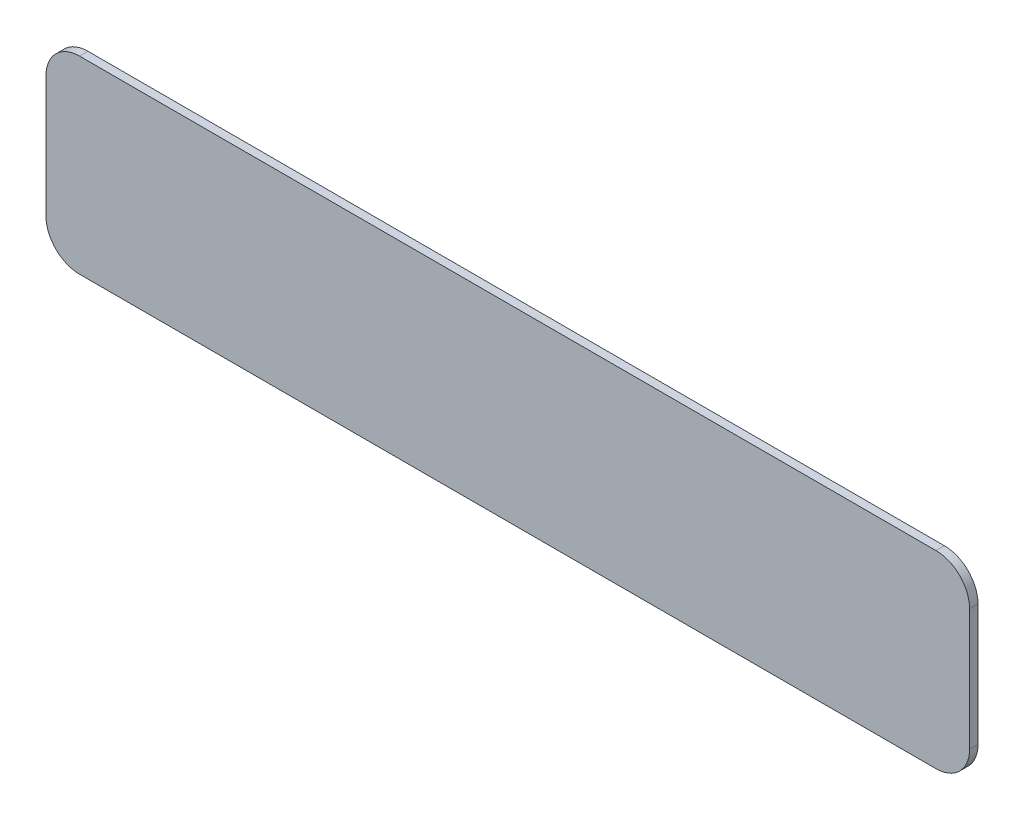
ISO-10303-21;
HEADER;
FILE_DESCRIPTION(('STEP AP214'),'2;1');
FILE_NAME('part.step','',(''),(''),'','','');
FILE_SCHEMA(('AUTOMOTIVE_DESIGN { 1 0 10303 214 1 1 1 1 }'));
ENDSEC;
DATA;
#1=APPLICATION_CONTEXT('core data for automotive mechanical design processes');
#2=APPLICATION_PROTOCOL_DEFINITION('international standard','automotive_design',2000,#1);
#3=PRODUCT_CONTEXT('',#1,'mechanical');
#4=PRODUCT('Part','Part','',(#3));
#5=PRODUCT_RELATED_PRODUCT_CATEGORY('part','',(#4));
#6=PRODUCT_DEFINITION_FORMATION('','',#4);
#7=PRODUCT_DEFINITION_CONTEXT('part definition',#1,'design');
#8=PRODUCT_DEFINITION('design','',#6,#7);
#9=PRODUCT_DEFINITION_SHAPE('','',#8);
#10=(LENGTH_UNIT() NAMED_UNIT(*) SI_UNIT(.MILLI.,.METRE.));
#11=(NAMED_UNIT(*) PLANE_ANGLE_UNIT() SI_UNIT($,.RADIAN.));
#12=(NAMED_UNIT(*) SI_UNIT($,.STERADIAN.) SOLID_ANGLE_UNIT());
#13=UNCERTAINTY_MEASURE_WITH_UNIT(LENGTH_MEASURE(1.E-05),#10,'distance_accuracy_value','');
#14=(GEOMETRIC_REPRESENTATION_CONTEXT(3) GLOBAL_UNCERTAINTY_ASSIGNED_CONTEXT((#13)) GLOBAL_UNIT_ASSIGNED_CONTEXT((#10,
#11,#12)) REPRESENTATION_CONTEXT('',''));
#15=CARTESIAN_POINT('',(0.,0.,0.));
#16=DIRECTION('',(0.,0.,1.));
#17=DIRECTION('',(1.,0.,0.));
#18=AXIS2_PLACEMENT_3D('',#15,#16,#17);
#19=CARTESIAN_POINT('',(51.,-7.24999999999999,1.));
#20=DIRECTION('',(0.,0.,-1.));
#21=DIRECTION('',(-1.,0.,0.));
#22=AXIS2_PLACEMENT_3D('',#19,#20,#21);
#23=CYLINDRICAL_SURFACE('',#22,4.);
#24=CARTESIAN_POINT('',(51.,-7.24999999999999,0.));
#25=DIRECTION('',(0.,0.,1.));
#26=DIRECTION('',(1.,0.,0.));
#27=AXIS2_PLACEMENT_3D('',#24,#25,#26);
#28=CIRCLE('',#27,4.);
#29=CARTESIAN_POINT('',(51.,-11.25,0.));
#30=VERTEX_POINT('',#29);
#31=CARTESIAN_POINT('',(55.,-7.24999999999996,0.));
#32=VERTEX_POINT('',#31);
#33=EDGE_CURVE('E143',#30,#32,#28,.T.);
#34=ORIENTED_EDGE('',*,*,#33,.T.);
#35=DIRECTION('',(0.,0.,-1.));
#36=VECTOR('',#35,1.);
#37=CARTESIAN_POINT('',(55.,-7.24999999999996,1.));
#38=LINE('',#37,#36);
#39=CARTESIAN_POINT('',(55.,-7.24999999999996,1.));
#40=VERTEX_POINT('',#39);
#41=EDGE_CURVE('E11',#40,#32,#38,.T.);
#42=ORIENTED_EDGE('',*,*,#41,.F.);
#43=CARTESIAN_POINT('',(51.,-7.24999999999999,1.));
#44=DIRECTION('',(0.,0.,1.));
#45=DIRECTION('',(1.,0.,0.));
#46=AXIS2_PLACEMENT_3D('',#43,#44,#45);
#47=CIRCLE('',#46,4.);
#48=CARTESIAN_POINT('',(51.,-11.25,1.));
#49=VERTEX_POINT('',#48);
#50=EDGE_CURVE('E157',#49,#40,#47,.T.);
#51=ORIENTED_EDGE('',*,*,#50,.F.);
#52=DIRECTION('',(0.,0.,-1.));
#53=VECTOR('',#52,1.);
#54=CARTESIAN_POINT('',(51.,-11.25,1.));
#55=LINE('',#54,#53);
#56=EDGE_CURVE('E139',#49,#30,#55,.T.);
#57=ORIENTED_EDGE('',*,*,#56,.T.);
#58=EDGE_LOOP('',(#34,#42,#51,#57));
#59=FACE_BOUND('',#58,.T.);
#60=ADVANCED_FACE('F47',(#59),#23,.T.);
#61=CARTESIAN_POINT('',(55.,7.24999999999998,1.));
#62=DIRECTION('',(-1.,0.,0.));
#63=DIRECTION('',(0.,0.,1.));
#64=AXIS2_PLACEMENT_3D('',#61,#62,#63);
#65=PLANE('',#64);
#66=DIRECTION('',(0.,1.,0.));
#67=VECTOR('',#66,1.);
#68=CARTESIAN_POINT('',(55.,7.24999999999998,0.));
#69=LINE('',#68,#67);
#70=CARTESIAN_POINT('',(55.,7.24999999999998,0.));
#71=VERTEX_POINT('',#70);
#72=EDGE_CURVE('E146',#32,#71,#69,.T.);
#73=ORIENTED_EDGE('',*,*,#72,.T.);
#74=DIRECTION('',(0.,0.,-1.));
#75=VECTOR('',#74,1.);
#76=CARTESIAN_POINT('',(55.,7.24999999999998,1.));
#77=LINE('',#76,#75);
#78=CARTESIAN_POINT('',(55.,7.24999999999998,1.));
#79=VERTEX_POINT('',#78);
#80=EDGE_CURVE('E55',#79,#71,#77,.T.);
#81=ORIENTED_EDGE('',*,*,#80,.F.);
#82=DIRECTION('',(0.,1.,0.));
#83=VECTOR('',#82,1.);
#84=CARTESIAN_POINT('',(55.,7.24999999999998,1.));
#85=LINE('',#84,#83);
#86=EDGE_CURVE('E106',#40,#79,#85,.T.);
#87=ORIENTED_EDGE('',*,*,#86,.F.);
#88=ORIENTED_EDGE('',*,*,#41,.T.);
#89=EDGE_LOOP('',(#73,#81,#87,#88));
#90=FACE_BOUND('',#89,.T.);
#91=ADVANCED_FACE('F192',(#90),#65,.F.);
#92=CARTESIAN_POINT('',(51.,7.25000000000001,1.));
#93=DIRECTION('',(0.,0.,-1.));
#94=DIRECTION('',(-1.,0.,0.));
#95=AXIS2_PLACEMENT_3D('',#92,#93,#94);
#96=CYLINDRICAL_SURFACE('',#95,4.);
#97=CARTESIAN_POINT('',(51.,7.25000000000001,0.));
#98=DIRECTION('',(0.,0.,1.));
#99=DIRECTION('',(1.,0.,0.));
#100=AXIS2_PLACEMENT_3D('',#97,#98,#99);
#101=CIRCLE('',#100,4.);
#102=CARTESIAN_POINT('',(51.,11.25,0.));
#103=VERTEX_POINT('',#102);
#104=EDGE_CURVE('E148',#71,#103,#101,.T.);
#105=ORIENTED_EDGE('',*,*,#104,.T.);
#106=DIRECTION('',(0.,0.,-1.));
#107=VECTOR('',#106,1.);
#108=CARTESIAN_POINT('',(51.,11.25,1.));
#109=LINE('',#108,#107);
#110=CARTESIAN_POINT('',(51.,11.25,1.));
#111=VERTEX_POINT('',#110);
#112=EDGE_CURVE('E164',#111,#103,#109,.T.);
#113=ORIENTED_EDGE('',*,*,#112,.F.);
#114=CARTESIAN_POINT('',(51.,7.25000000000001,1.));
#115=DIRECTION('',(0.,0.,1.));
#116=DIRECTION('',(1.,0.,0.));
#117=AXIS2_PLACEMENT_3D('',#114,#115,#116);
#118=CIRCLE('',#117,4.);
#119=EDGE_CURVE('E172',#79,#111,#118,.T.);
#120=ORIENTED_EDGE('',*,*,#119,.F.);
#121=ORIENTED_EDGE('',*,*,#80,.T.);
#122=EDGE_LOOP('',(#105,#113,#120,#121));
#123=FACE_BOUND('',#122,.T.);
#124=ADVANCED_FACE('F170',(#123),#96,.T.);
#125=CARTESIAN_POINT('',(-50.9999999999999,11.25,1.));
#126=DIRECTION('',(0.,-1.,0.));
#127=DIRECTION('',(0.,0.,-1.));
#128=AXIS2_PLACEMENT_3D('',#125,#126,#127);
#129=PLANE('',#128);
#130=DIRECTION('',(-1.,0.,0.));
#131=VECTOR('',#130,1.);
#132=CARTESIAN_POINT('',(-50.9999999999999,11.25,0.));
#133=LINE('',#132,#131);
#134=CARTESIAN_POINT('',(-50.9999999999999,11.25,0.));
#135=VERTEX_POINT('',#134);
#136=EDGE_CURVE('E150',#103,#135,#133,.T.);
#137=ORIENTED_EDGE('',*,*,#136,.T.);
#138=DIRECTION('',(0.,0.,-1.));
#139=VECTOR('',#138,1.);
#140=CARTESIAN_POINT('',(-50.9999999999999,11.25,1.));
#141=LINE('',#140,#139);
#142=CARTESIAN_POINT('',(-50.9999999999999,11.25,1.));
#143=VERTEX_POINT('',#142);
#144=EDGE_CURVE('E161',#143,#135,#141,.T.);
#145=ORIENTED_EDGE('',*,*,#144,.F.);
#146=DIRECTION('',(-1.,0.,0.));
#147=VECTOR('',#146,1.);
#148=CARTESIAN_POINT('',(-50.9999999999999,11.25,1.));
#149=LINE('',#148,#147);
#150=EDGE_CURVE('E184',#111,#143,#149,.T.);
#151=ORIENTED_EDGE('',*,*,#150,.F.);
#152=ORIENTED_EDGE('',*,*,#112,.T.);
#153=EDGE_LOOP('',(#137,#145,#151,#152));
#154=FACE_BOUND('',#153,.T.);
#155=ADVANCED_FACE('F180',(#154),#129,.F.);
#156=CARTESIAN_POINT('',(-51.,7.25000000000001,1.));
#157=DIRECTION('',(0.,0.,-1.));
#158=DIRECTION('',(-1.,0.,0.));
#159=AXIS2_PLACEMENT_3D('',#156,#157,#158);
#160=CYLINDRICAL_SURFACE('',#159,4.);
#161=CARTESIAN_POINT('',(-51.,7.25000000000001,0.));
#162=DIRECTION('',(0.,0.,1.));
#163=DIRECTION('',(-1.,0.,0.));
#164=AXIS2_PLACEMENT_3D('',#161,#162,#163);
#165=CIRCLE('',#164,4.);
#166=CARTESIAN_POINT('',(-55.,7.24999999999998,0.));
#167=VERTEX_POINT('',#166);
#168=EDGE_CURVE('E152',#135,#167,#165,.T.);
#169=ORIENTED_EDGE('',*,*,#168,.T.);
#170=DIRECTION('',(0.,0.,-1.));
#171=VECTOR('',#170,1.);
#172=CARTESIAN_POINT('',(-55.,7.24999999999998,1.));
#173=LINE('',#172,#171);
#174=CARTESIAN_POINT('',(-55.,7.24999999999998,1.));
#175=VERTEX_POINT('',#174);
#176=EDGE_CURVE('E134',#175,#167,#173,.T.);
#177=ORIENTED_EDGE('',*,*,#176,.F.);
#178=CARTESIAN_POINT('',(-51.,7.25000000000001,1.));
#179=DIRECTION('',(0.,0.,1.));
#180=DIRECTION('',(-1.,0.,0.));
#181=AXIS2_PLACEMENT_3D('',#178,#179,#180);
#182=CIRCLE('',#181,4.);
#183=EDGE_CURVE('E125',#143,#175,#182,.T.);
#184=ORIENTED_EDGE('',*,*,#183,.F.);
#185=ORIENTED_EDGE('',*,*,#144,.T.);
#186=EDGE_LOOP('',(#169,#177,#184,#185));
#187=FACE_BOUND('',#186,.T.);
#188=ADVANCED_FACE('F183',(#187),#160,.T.);
#189=CARTESIAN_POINT('',(-55.,7.24999999999998,1.));
#190=DIRECTION('',(1.,0.,0.));
#191=DIRECTION('',(0.,1.,0.));
#192=AXIS2_PLACEMENT_3D('',#189,#190,#191);
#193=PLANE('',#192);
#194=DIRECTION('',(0.,-1.,0.));
#195=VECTOR('',#194,1.);
#196=CARTESIAN_POINT('',(-55.,7.24999999999998,0.));
#197=LINE('',#196,#195);
#198=CARTESIAN_POINT('',(-55.,-7.24999999999999,0.));
#199=VERTEX_POINT('',#198);
#200=EDGE_CURVE('E133',#167,#199,#197,.T.);
#201=ORIENTED_EDGE('',*,*,#200,.T.);
#202=DIRECTION('',(0.,0.,-1.));
#203=VECTOR('',#202,1.);
#204=CARTESIAN_POINT('',(-55.,-7.24999999999999,1.));
#205=LINE('',#204,#203);
#206=CARTESIAN_POINT('',(-55.,-7.24999999999999,1.));
#207=VERTEX_POINT('',#206);
#208=EDGE_CURVE('E130',#207,#199,#205,.T.);
#209=ORIENTED_EDGE('',*,*,#208,.F.);
#210=DIRECTION('',(0.,-1.,0.));
#211=VECTOR('',#210,1.);
#212=CARTESIAN_POINT('',(-55.,7.24999999999998,1.));
#213=LINE('',#212,#211);
#214=EDGE_CURVE('E119',#175,#207,#213,.T.);
#215=ORIENTED_EDGE('',*,*,#214,.F.);
#216=ORIENTED_EDGE('',*,*,#176,.T.);
#217=EDGE_LOOP('',(#201,#209,#215,#216));
#218=FACE_BOUND('',#217,.T.);
#219=ADVANCED_FACE('F131',(#218),#193,.F.);
#220=CARTESIAN_POINT('',(-51.,-7.24999999999999,1.));
#221=DIRECTION('',(0.,0.,-1.));
#222=DIRECTION('',(-1.,0.,0.));
#223=AXIS2_PLACEMENT_3D('',#220,#221,#222);
#224=CYLINDRICAL_SURFACE('',#223,4.);
#225=CARTESIAN_POINT('',(-51.,-7.24999999999999,0.));
#226=DIRECTION('',(0.,0.,1.));
#227=DIRECTION('',(-1.,0.,0.));
#228=AXIS2_PLACEMENT_3D('',#225,#226,#227);
#229=CIRCLE('',#228,4.);
#230=CARTESIAN_POINT('',(-50.9999999999999,-11.25,0.));
#231=VERTEX_POINT('',#230);
#232=EDGE_CURVE('E92',#199,#231,#229,.T.);
#233=ORIENTED_EDGE('',*,*,#232,.T.);
#234=DIRECTION('',(0.,0.,-1.));
#235=VECTOR('',#234,1.);
#236=CARTESIAN_POINT('',(-50.9999999999999,-11.25,1.));
#237=LINE('',#236,#235);
#238=CARTESIAN_POINT('',(-50.9999999999999,-11.25,1.));
#239=VERTEX_POINT('',#238);
#240=EDGE_CURVE('E135',#239,#231,#237,.T.);
#241=ORIENTED_EDGE('',*,*,#240,.F.);
#242=CARTESIAN_POINT('',(-51.,-7.24999999999999,1.));
#243=DIRECTION('',(0.,0.,1.));
#244=DIRECTION('',(-1.,0.,0.));
#245=AXIS2_PLACEMENT_3D('',#242,#243,#244);
#246=CIRCLE('',#245,4.);
#247=EDGE_CURVE('E123',#207,#239,#246,.T.);
#248=ORIENTED_EDGE('',*,*,#247,.F.);
#249=ORIENTED_EDGE('',*,*,#208,.T.);
#250=EDGE_LOOP('',(#233,#241,#248,#249));
#251=FACE_BOUND('',#250,.T.);
#252=ADVANCED_FACE('F137',(#251),#224,.T.);
#253=CARTESIAN_POINT('',(-50.9999999999999,-11.25,1.));
#254=DIRECTION('',(0.,1.,0.));
#255=DIRECTION('',(0.,0.,1.));
#256=AXIS2_PLACEMENT_3D('',#253,#254,#255);
#257=PLANE('',#256);
#258=DIRECTION('',(1.,0.,0.));
#259=VECTOR('',#258,1.);
#260=CARTESIAN_POINT('',(-50.9999999999999,-11.25,0.));
#261=LINE('',#260,#259);
#262=EDGE_CURVE('E98',#231,#30,#261,.T.);
#263=ORIENTED_EDGE('',*,*,#262,.T.);
#264=ORIENTED_EDGE('',*,*,#56,.F.);
#265=DIRECTION('',(1.,0.,0.));
#266=VECTOR('',#265,1.);
#267=CARTESIAN_POINT('',(-50.9999999999999,-11.25,1.));
#268=LINE('',#267,#266);
#269=EDGE_CURVE('E63',#239,#49,#268,.T.);
#270=ORIENTED_EDGE('',*,*,#269,.F.);
#271=ORIENTED_EDGE('',*,*,#240,.T.);
#272=EDGE_LOOP('',(#263,#264,#270,#271));
#273=FACE_BOUND('',#272,.T.);
#274=ADVANCED_FACE('F208',(#273),#257,.F.);
#275=CARTESIAN_POINT('',(51.,-7.24999999999999,1.));
#276=DIRECTION('',(0.,0.,1.));
#277=DIRECTION('',(1.,0.,0.));
#278=AXIS2_PLACEMENT_3D('',#275,#276,#277);
#279=PLANE('',#278);
#280=ORIENTED_EDGE('',*,*,#50,.T.);
#281=ORIENTED_EDGE('',*,*,#86,.T.);
#282=ORIENTED_EDGE('',*,*,#119,.T.);
#283=ORIENTED_EDGE('',*,*,#150,.T.);
#284=ORIENTED_EDGE('',*,*,#183,.T.);
#285=ORIENTED_EDGE('',*,*,#214,.T.);
#286=ORIENTED_EDGE('',*,*,#247,.T.);
#287=ORIENTED_EDGE('',*,*,#269,.T.);
#288=EDGE_LOOP('',(#280,#281,#282,#283,#284,#285,#286,#287));
#289=FACE_BOUND('',#288,.T.);
#290=ADVANCED_FACE('F121',(#289),#279,.T.);
#291=CARTESIAN_POINT('',(51.,-7.24999999999999,0.));
#292=DIRECTION('',(0.,0.,1.));
#293=DIRECTION('',(1.,0.,0.));
#294=AXIS2_PLACEMENT_3D('',#291,#292,#293);
#295=PLANE('',#294);
#296=ORIENTED_EDGE('',*,*,#33,.F.);
#297=ORIENTED_EDGE('',*,*,#262,.F.);
#298=ORIENTED_EDGE('',*,*,#232,.F.);
#299=ORIENTED_EDGE('',*,*,#200,.F.);
#300=ORIENTED_EDGE('',*,*,#168,.F.);
#301=ORIENTED_EDGE('',*,*,#136,.F.);
#302=ORIENTED_EDGE('',*,*,#104,.F.);
#303=ORIENTED_EDGE('',*,*,#72,.F.);
#304=EDGE_LOOP('',(#296,#297,#298,#299,#300,#301,#302,#303));
#305=FACE_BOUND('',#304,.T.);
#306=ADVANCED_FACE('F176',(#305),#295,.F.);
#307=CLOSED_SHELL('',(#60,#91,#124,#155,#188,#219,#252,#274,#290,#306));
#308=MANIFOLD_SOLID_BREP('B2',#307);
#309=ADVANCED_BREP_SHAPE_REPRESENTATION('',(#18,#308),#14);
#310=SHAPE_DEFINITION_REPRESENTATION(#9,#309);
ENDSEC;
END-ISO-10303-21;
